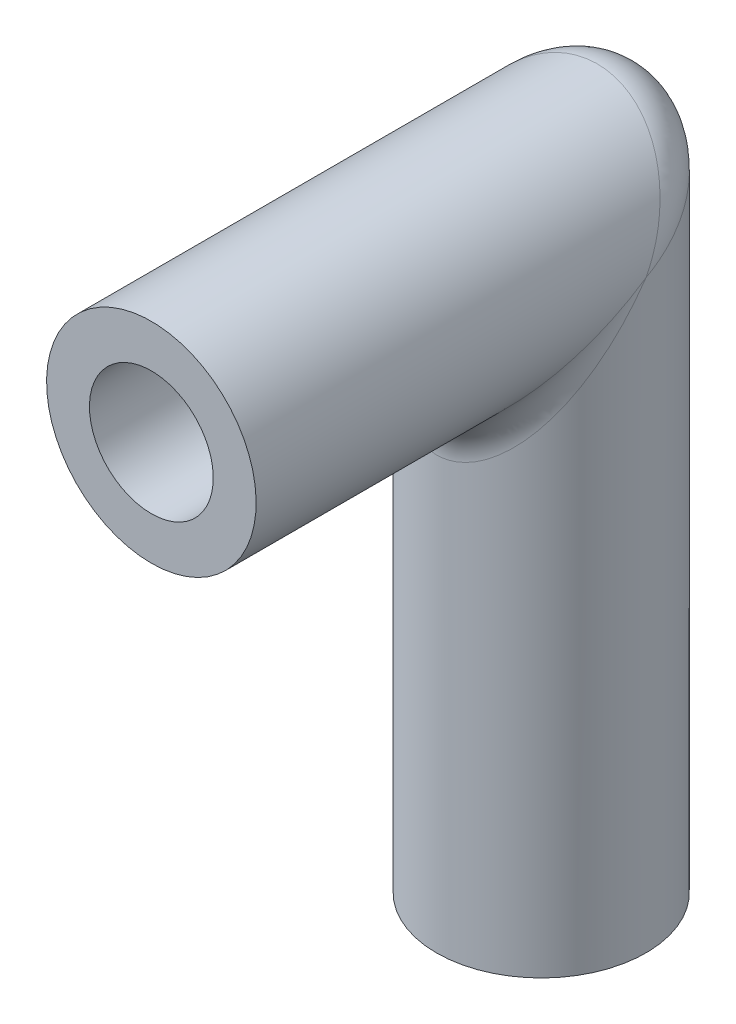
ISO-10303-21;
HEADER;
FILE_DESCRIPTION(('STEP AP214'),'2;1');
FILE_NAME('part.step','',(''),(''),'','','');
FILE_SCHEMA(('AUTOMOTIVE_DESIGN { 1 0 10303 214 1 1 1 1 }'));
ENDSEC;
DATA;
#1=APPLICATION_CONTEXT('core data for automotive mechanical design processes');
#2=APPLICATION_PROTOCOL_DEFINITION('international standard','automotive_design',2000,#1);
#3=PRODUCT_CONTEXT('',#1,'mechanical');
#4=PRODUCT('Part','Part','',(#3));
#5=PRODUCT_RELATED_PRODUCT_CATEGORY('part','',(#4));
#6=PRODUCT_DEFINITION_FORMATION('','',#4);
#7=PRODUCT_DEFINITION_CONTEXT('part definition',#1,'design');
#8=PRODUCT_DEFINITION('design','',#6,#7);
#9=PRODUCT_DEFINITION_SHAPE('','',#8);
#10=(LENGTH_UNIT() NAMED_UNIT(*) SI_UNIT(.MILLI.,.METRE.));
#11=(NAMED_UNIT(*) PLANE_ANGLE_UNIT() SI_UNIT($,.RADIAN.));
#12=(NAMED_UNIT(*) SI_UNIT($,.STERADIAN.) SOLID_ANGLE_UNIT());
#13=UNCERTAINTY_MEASURE_WITH_UNIT(LENGTH_MEASURE(1.E-05),#10,'distance_accuracy_value','');
#14=(GEOMETRIC_REPRESENTATION_CONTEXT(3) GLOBAL_UNCERTAINTY_ASSIGNED_CONTEXT((#13)) GLOBAL_UNIT_ASSIGNED_CONTEXT((#10,
#11,#12)) REPRESENTATION_CONTEXT('',''));
#15=CARTESIAN_POINT('',(0.,0.,0.));
#16=DIRECTION('',(0.,0.,1.));
#17=DIRECTION('',(1.,0.,0.));
#18=AXIS2_PLACEMENT_3D('',#15,#16,#17);
#19=CARTESIAN_POINT('',(0.,60.,-11.925));
#20=DIRECTION('',(0.,0.,1.));
#21=DIRECTION('',(0.,-1.,0.));
#22=AXIS2_PLACEMENT_3D('',#19,#20,#21);
#23=CYLINDRICAL_SURFACE('',#22,10.75);
#24=CARTESIAN_POINT('',(0.,60.,0.));
#25=DIRECTION('',(0.,-0.825949873501593,-0.563743564453468));
#26=DIRECTION('',(0.,0.563743564453469,-0.825949873501593));
#27=AXIS2_PLACEMENT_3D('',#24,#25,#26);
#28=ELLIPSE('',#27,19.0689538255249,10.75);
#29=CARTESIAN_POINT('',(-10.75,60.,0.));
#30=VERTEX_POINT('',#29);
#31=CARTESIAN_POINT('',(10.75,60.,0.));
#32=VERTEX_POINT('',#31);
#33=EDGE_CURVE('E51',#30,#32,#28,.F.);
#34=ORIENTED_EDGE('',*,*,#33,.T.);
#35=CARTESIAN_POINT('',(0.,60.,0.));
#36=DIRECTION('',(0.,-0.47165225033716,-0.881784641934692));
#37=DIRECTION('',(0.,0.881784641934692,-0.47165225033716));
#38=AXIS2_PLACEMENT_3D('',#35,#36,#37);
#39=ELLIPSE('',#38,12.1911853402366,10.75);
#40=EDGE_CURVE('E11',#32,#30,#39,.F.);
#41=ORIENTED_EDGE('',*,*,#40,.T.);
#42=EDGE_LOOP('',(#34,#41));
#43=FACE_BOUND('',#42,.T.);
#44=CARTESIAN_POINT('',(0.,60.,40.));
#45=DIRECTION('',(0.,0.,1.));
#46=DIRECTION('',(0.,-1.,0.));
#47=AXIS2_PLACEMENT_3D('',#44,#45,#46);
#48=CIRCLE('',#47,10.75);
#49=CARTESIAN_POINT('',(0.,49.25,40.));
#50=VERTEX_POINT('',#49);
#51=EDGE_CURVE('E116',#50,#50,#48,.T.);
#52=ORIENTED_EDGE('',*,*,#51,.F.);
#53=EDGE_LOOP('',(#52));
#54=FACE_BOUND('',#53,.T.);
#55=ADVANCED_FACE('F38',(#43,#54),#23,.T.);
#56=CARTESIAN_POINT('',(0.,0.,0.));
#57=DIRECTION('',(0.,1.,0.));
#58=DIRECTION('',(0.,0.,1.));
#59=AXIS2_PLACEMENT_3D('',#56,#57,#58);
#60=CYLINDRICAL_SURFACE('',#59,10.75);
#61=CARTESIAN_POINT('',(0.,0.,0.));
#62=DIRECTION('',(0.,1.,0.));
#63=DIRECTION('',(0.,0.,1.));
#64=AXIS2_PLACEMENT_3D('',#61,#62,#63);
#65=CIRCLE('',#64,10.75);
#66=CARTESIAN_POINT('',(0.,0.,10.75));
#67=VERTEX_POINT('',#66);
#68=EDGE_CURVE('E114',#67,#67,#65,.T.);
#69=ORIENTED_EDGE('',*,*,#68,.T.);
#70=EDGE_LOOP('',(#69));
#71=FACE_BOUND('',#70,.T.);
#72=CARTESIAN_POINT('',(0.,60.,0.));
#73=DIRECTION('',(0.,-0.881784641934692,-0.47165225033716));
#74=DIRECTION('',(0.,0.471652250337161,-0.881784641934692));
#75=AXIS2_PLACEMENT_3D('',#72,#73,#74);
#76=ELLIPSE('',#75,12.1911853402366,10.75);
#77=EDGE_CURVE('E62',#30,#32,#76,.T.);
#78=ORIENTED_EDGE('',*,*,#77,.T.);
#79=CARTESIAN_POINT('',(0.,60.,0.));
#80=DIRECTION('',(0.,-0.563743564453468,-0.825949873501593));
#81=DIRECTION('',(0.,0.825949873501593,-0.563743564453468));
#82=AXIS2_PLACEMENT_3D('',#79,#80,#81);
#83=ELLIPSE('',#82,19.0689538255249,10.75);
#84=EDGE_CURVE('E66',#32,#30,#83,.T.);
#85=ORIENTED_EDGE('',*,*,#84,.T.);
#86=EDGE_LOOP('',(#78,#85));
#87=FACE_BOUND('',#86,.T.);
#88=ADVANCED_FACE('F69',(#71,#87),#60,.T.);
#89=CARTESIAN_POINT('',(0.,60.,40.));
#90=DIRECTION('',(0.,0.,1.));
#91=DIRECTION('',(0.,-1.,0.));
#92=AXIS2_PLACEMENT_3D('',#89,#90,#91);
#93=PLANE('',#92);
#94=CARTESIAN_POINT('',(0.,60.,40.));
#95=DIRECTION('',(0.,0.,1.));
#96=DIRECTION('',(0.,-1.,0.));
#97=AXIS2_PLACEMENT_3D('',#94,#95,#96);
#98=CIRCLE('',#97,6.35);
#99=CARTESIAN_POINT('',(0.,53.65,40.));
#100=VERTEX_POINT('',#99);
#101=EDGE_CURVE('E109',#100,#100,#98,.F.);
#102=ORIENTED_EDGE('',*,*,#101,.T.);
#103=EDGE_LOOP('',(#102));
#104=FACE_BOUND('',#103,.T.);
#105=ORIENTED_EDGE('',*,*,#51,.T.);
#106=EDGE_LOOP('',(#105));
#107=FACE_BOUND('',#106,.T.);
#108=ADVANCED_FACE('F84',(#104,#107),#93,.T.);
#109=CARTESIAN_POINT('',(0.,0.,0.));
#110=DIRECTION('',(0.,1.,0.));
#111=DIRECTION('',(0.,0.,1.));
#112=AXIS2_PLACEMENT_3D('',#109,#110,#111);
#113=PLANE('',#112);
#114=CARTESIAN_POINT('',(0.,0.,0.));
#115=DIRECTION('',(0.,1.,0.));
#116=DIRECTION('',(0.,0.,1.));
#117=AXIS2_PLACEMENT_3D('',#114,#115,#116);
#118=CIRCLE('',#117,6.35);
#119=CARTESIAN_POINT('',(0.,0.,6.35));
#120=VERTEX_POINT('',#119);
#121=EDGE_CURVE('E105',#120,#120,#118,.F.);
#122=ORIENTED_EDGE('',*,*,#121,.F.);
#123=EDGE_LOOP('',(#122));
#124=FACE_BOUND('',#123,.T.);
#125=ORIENTED_EDGE('',*,*,#68,.F.);
#126=EDGE_LOOP('',(#125));
#127=FACE_BOUND('',#126,.T.);
#128=ADVANCED_FACE('F89',(#124,#127),#113,.F.);
#129=CARTESIAN_POINT('',(0.,60.,-7.08500000000001));
#130=DIRECTION('',(0.,0.,1.));
#131=DIRECTION('',(0.,-1.,0.));
#132=AXIS2_PLACEMENT_3D('',#129,#130,#131);
#133=CYLINDRICAL_SURFACE('',#132,6.35);
#134=CARTESIAN_POINT('',(0.,60.,0.));
#135=DIRECTION('',(0.,0.707106781186547,0.707106781186548));
#136=DIRECTION('',(0.,0.707106781186548,-0.707106781186547));
#137=AXIS2_PLACEMENT_3D('',#134,#135,#136);
#138=ELLIPSE('',#137,8.98025612106915,6.35);
#139=CARTESIAN_POINT('',(0.,66.35,-6.35));
#140=VERTEX_POINT('',#139);
#141=EDGE_CURVE('E70',#140,#140,#138,.T.);
#142=ORIENTED_EDGE('',*,*,#141,.F.);
#143=EDGE_LOOP('',(#142));
#144=FACE_BOUND('',#143,.T.);
#145=ORIENTED_EDGE('',*,*,#101,.F.);
#146=EDGE_LOOP('',(#145));
#147=FACE_BOUND('',#146,.T.);
#148=ADVANCED_FACE('F93',(#144,#147),#133,.F.);
#149=CARTESIAN_POINT('',(0.,0.,0.));
#150=DIRECTION('',(0.,1.,0.));
#151=DIRECTION('',(0.,0.,1.));
#152=AXIS2_PLACEMENT_3D('',#149,#150,#151);
#153=CYLINDRICAL_SURFACE('',#152,6.35);
#154=ORIENTED_EDGE('',*,*,#121,.T.);
#155=EDGE_LOOP('',(#154));
#156=FACE_BOUND('',#155,.T.);
#157=ORIENTED_EDGE('',*,*,#141,.T.);
#158=EDGE_LOOP('',(#157));
#159=FACE_BOUND('',#158,.T.);
#160=ADVANCED_FACE('F79',(#156,#159),#153,.F.);
#161=CARTESIAN_POINT('',(-10.75,60.,0.));
#162=CARTESIAN_POINT('',(-10.75,60.,0.));
#163=CARTESIAN_POINT('',(-10.75,60.,0.));
#164=CARTESIAN_POINT('',(-10.7499864952657,59.765792574378,0.343141111957927));
#165=CARTESIAN_POINT('',(-10.7500300295719,59.7113261174278,0.28867388257221));
#166=CARTESIAN_POINT('',(-10.7499864952657,59.6568588880421,0.234207425622054));
#167=CARTESIAN_POINT('',(-10.7423462808876,59.5316189407649,0.686232714693343));
#168=CARTESIAN_POINT('',(-10.738775653555,59.4224886744545,0.577511325545491));
#169=CARTESIAN_POINT('',(-10.7423462808876,59.3137672853067,0.468381059235112));
#170=CARTESIAN_POINT('',(-10.7117215273002,59.0637549546507,1.37170785713967));
#171=CARTESIAN_POINT('',(-10.6939192618354,58.8465163304425,1.1534836695575));
#172=CARTESIAN_POINT('',(-10.7117215273002,58.6282921428603,0.936245045349278));
#173=CARTESIAN_POINT('',(-10.688735708069,58.8300646440963,1.71409133539385));
#174=CARTESIAN_POINT('',(-10.6602515009435,58.5589733481407,1.44102665185928));
#175=CARTESIAN_POINT('',(-10.688735708069,58.2859086646062,1.16993535590373));
#176=CARTESIAN_POINT('',(-10.5971662296306,58.1345093959128,2.73316065249983));
#177=CARTESIAN_POINT('',(-10.5262302648046,57.7046610417163,2.29533895828375));
#178=CARTESIAN_POINT('',(-10.5971662296306,57.2668393475002,1.8654906040872));
#179=CARTESIAN_POINT('',(-10.5059710978055,57.6740188497976,3.40783284797095));
#180=CARTESIAN_POINT('',(-10.39242845443,57.1411091149097,2.85889088509035));
#181=CARTESIAN_POINT('',(-10.5059710978055,56.5921671520291,2.3259811502024));
#182=CARTESIAN_POINT('',(-10.2634849708032,56.7690255751843,4.73375322705557));
#183=CARTESIAN_POINT('',(-10.0412325352975,56.0481165286478,3.95188347135216));
#184=CARTESIAN_POINT('',(-10.2634849708032,55.2662467729444,3.2309744248157));
#185=CARTESIAN_POINT('',(-10.1132276169115,56.3243842344763,5.38520449367421));
#186=CARTESIAN_POINT('',(-9.82333101973887,55.515442956505,4.48455704349502));
#187=CARTESIAN_POINT('',(-10.1132276169115,54.6147955063258,3.67561576552366));
#188=CARTESIAN_POINT('',(-9.75465403234978,55.4587175279937,6.65350687759067));
#189=CARTESIAN_POINT('',(-9.3122604088946,54.4988504090812,5.5011495909188));
#190=CARTESIAN_POINT('',(-9.75465403234978,53.3464931224093,4.54128247200634));
#191=CARTESIAN_POINT('',(-9.54785923109783,55.037380229083,7.27081501320391));
#192=CARTESIAN_POINT('',(-9.01834291721466,54.0118033131634,5.98819668683661));
#193=CARTESIAN_POINT('',(-9.54785923109784,52.7291849867961,4.96261977091698));
#194=CARTESIAN_POINT('',(-9.07926524767911,54.2257458605632,8.45995373917482));
#195=CARTESIAN_POINT('',(-8.36753139008858,53.100251965459,6.89974803454102));
#196=CARTESIAN_POINT('',(-9.07926524767911,51.5400462608252,5.77425413943676));
#197=CARTESIAN_POINT('',(-8.81942637333802,53.8348876576007,9.03260645514335));
#198=CARTESIAN_POINT('',(-8.00968896071207,52.6728098721454,7.3271901278546));
#199=CARTESIAN_POINT('',(-8.81942637333802,50.9673935448567,6.16511234239935));
#200=CARTESIAN_POINT('',(-8.24872192375031,53.0911439410169,10.1222774817659));
#201=CARTESIAN_POINT('',(-7.24792613742725,51.8923212241812,8.10767877581882));
#202=CARTESIAN_POINT('',(-8.24872192375031,49.8777225182341,6.90885605898315));
#203=CARTESIAN_POINT('',(-7.94017011260427,52.7373799179489,10.6405829109116));
#204=CARTESIAN_POINT('',(-6.84295062593441,51.5366444676399,8.46335553236005));
#205=CARTESIAN_POINT('',(-7.94017011260428,49.3594170890884,7.26262008205108));
#206=CARTESIAN_POINT('',(-7.27705809737741,52.0742569396195,11.6121351814881));
#207=CARTESIAN_POINT('',(-6.00885454094664,50.9080827349302,9.09191726506977));
#208=CARTESIAN_POINT('',(-7.27705809737741,48.3878648185119,7.92574306038046));
#209=CARTESIAN_POINT('',(-6.92501795157464,51.7636482950325,12.0672129630935));
#210=CARTESIAN_POINT('',(-5.57874882876969,50.6330144232213,9.36698557677865));
#211=CARTESIAN_POINT('',(-6.92501795157464,47.9327870369065,8.23635170496754));
#212=CARTESIAN_POINT('',(-6.18047045521437,51.1923885613562,12.9041748984767));
#213=CARTESIAN_POINT('',(-4.72057386704508,50.1683007671008,9.83169923289918));
#214=CARTESIAN_POINT('',(-6.18047045521437,47.0958251015233,8.8076114386438));
#215=CARTESIAN_POINT('',(-5.79049326303583,50.9301195086102,13.2884295571472));
#216=CARTESIAN_POINT('',(-4.29184164878177,49.9770306113492,10.0229693886509));
#217=CARTESIAN_POINT('',(-5.79049326303583,46.7115704428528,9.06988049138978));
#218=CARTESIAN_POINT('',(-5.17623535189942,50.57546652131,13.8080374222692));
#219=CARTESIAN_POINT('',(-3.67099922835243,49.7494075025635,10.2505924974365));
#220=CARTESIAN_POINT('',(-5.17623535189942,46.1919625777308,9.42453347868998));
#221=CARTESIAN_POINT('',(-4.97163135906662,50.4658269775867,13.9686721026127));
#222=CARTESIAN_POINT('',(-3.46991448249914,49.6838468587943,10.3161531412057));
#223=CARTESIAN_POINT('',(-4.97163135906662,46.0313278973873,9.53417302241335));
#224=CARTESIAN_POINT('',(-4.55108192073747,50.2580755999522,14.2730520279818));
#225=CARTESIAN_POINT('',(-3.07354574800001,49.5688403463363,10.4311596536637));
#226=CARTESIAN_POINT('',(-4.55108192073747,45.7269479720182,9.74192440004778));
#227=CARTESIAN_POINT('',(-4.33514155829133,50.1599586622989,14.4168047505833));
#228=CARTESIAN_POINT('',(-2.87850585160852,49.5196707823381,10.4803292176619));
#229=CARTESIAN_POINT('',(-4.33514155829133,45.5831952494167,9.84004133770112));
#230=CARTESIAN_POINT('',(-3.90113860189644,49.9801879922921,14.6801896857136));
#231=CARTESIAN_POINT('',(-2.50490506135847,49.4378273782373,10.5621726217627));
#232=CARTESIAN_POINT('',(-3.90113860189644,45.3198103142864,10.0198120077079));
#233=CARTESIAN_POINT('',(-3.68348344700928,49.8980431914765,14.8005413706397));
#234=CARTESIAN_POINT('',(-2.32623783990868,49.4048026506903,10.5951973493097));
#235=CARTESIAN_POINT('',(-3.68348344700928,45.1994586293603,10.1019568085235));
#236=CARTESIAN_POINT('',(-3.23927275192173,49.7469710153319,15.0218796752239));
#237=CARTESIAN_POINT('',(-1.97947825338666,49.350536689707,10.649463310293));
#238=CARTESIAN_POINT('',(-3.23927275192173,44.9781203247761,10.2530289846681));
#239=CARTESIAN_POINT('',(-3.01272157822205,49.6780372508698,15.122875655705));
#240=CARTESIAN_POINT('',(-1.81179083989099,49.3294773406818,10.6705226593182));
#241=CARTESIAN_POINT('',(-3.01272157822205,44.877124344295,10.3219627491302));
#242=CARTESIAN_POINT('',(-2.55872178852412,49.5563886174422,15.3011050488613));
#243=CARTESIAN_POINT('',(-1.49277861554929,49.2970149508268,10.7029850491732));
#244=CARTESIAN_POINT('',(-2.55872178852412,44.6988949511387,10.4436113825578));
#245=CARTESIAN_POINT('',(-2.33149907468291,49.5032533521752,15.378954391001));
#246=CARTESIAN_POINT('',(-1.34149541360153,49.2854605895732,10.7145394104268));
#247=CARTESIAN_POINT('',(-2.3314990746829,44.621045608999,10.4967466478248));
#248=CARTESIAN_POINT('',(-1.87124364696235,49.411515949136,15.513360353595));
#249=CARTESIAN_POINT('',(-1.04919407595017,49.2682929224236,10.7317070775764));
#250=CARTESIAN_POINT('',(-1.87124364696235,44.486639646405,10.588484050864));
#251=CARTESIAN_POINT('',(-1.63821119394491,49.3729131600926,15.5699179282373));
#252=CARTESIAN_POINT('',(-0.908605290340172,49.2627479448982,10.7372520551018));
#253=CARTESIAN_POINT('',(-1.63821119394491,44.4300820717627,10.6270868399075));
#254=CARTESIAN_POINT('',(-1.17193543651173,49.3115270081441,15.6598557787649));
#255=CARTESIAN_POINT('',(-0.637650171709598,49.2551451438805,10.7448548561195));
#256=CARTESIAN_POINT('',(-1.17193543651173,44.3401442212351,10.6884729918559));
#257=CARTESIAN_POINT('',(-0.938757553382102,49.28849591443,15.6935990090913));
#258=CARTESIAN_POINT('',(-0.507539452800943,49.2530600810066,10.7469399189934));
#259=CARTESIAN_POINT('',(-0.938757553382102,44.3064009909087,10.71150408557));
#260=CARTESIAN_POINT('',(-0.470386422887839,49.2577325464131,15.7386709203723));
#261=CARTESIAN_POINT('',(-0.251431481154688,49.2504834397004,10.7495165602996));
#262=CARTESIAN_POINT('',(-0.470386422887839,44.2613290796277,10.7422674535869));
#263=CARTESIAN_POINT('',(-0.23519321144392,49.25,15.75));
#264=CARTESIAN_POINT('',(-0.125806364460488,49.25,10.75));
#265=CARTESIAN_POINT('',(-0.23519321144392,44.25,10.75));
#266=CARTESIAN_POINT('',(0.235193211443917,49.25,15.75));
#267=CARTESIAN_POINT('',(0.125806364460487,49.25,10.75));
#268=CARTESIAN_POINT('',(0.235193211443918,44.25,10.75));
#269=CARTESIAN_POINT('',(0.470386422887836,49.2577325464131,15.7386709203723));
#270=CARTESIAN_POINT('',(0.251431481154686,49.2504834397004,10.7495165602996));
#271=CARTESIAN_POINT('',(0.470386422887836,44.2613290796277,10.7422674535869));
#272=CARTESIAN_POINT('',(0.938757553382099,49.28849591443,15.6935990090913));
#273=CARTESIAN_POINT('',(0.507539452800941,49.2530600810066,10.7469399189934));
#274=CARTESIAN_POINT('',(0.938757553382099,44.3064009909087,10.71150408557));
#275=CARTESIAN_POINT('',(1.17193543651172,49.3115270081441,15.6598557787649));
#276=CARTESIAN_POINT('',(0.637650171709596,49.2551451438805,10.7448548561194));
#277=CARTESIAN_POINT('',(1.17193543651172,44.3401442212351,10.6884729918559));
#278=CARTESIAN_POINT('',(1.63821119394491,49.3729131600926,15.5699179282373));
#279=CARTESIAN_POINT('',(0.908605290340172,49.2627479448982,10.7372520551018));
#280=CARTESIAN_POINT('',(1.63821119394491,44.4300820717627,10.6270868399075));
#281=CARTESIAN_POINT('',(1.87124364696235,49.411515949136,15.513360353595));
#282=CARTESIAN_POINT('',(1.04919407595017,49.2682929224236,10.7317070775764));
#283=CARTESIAN_POINT('',(1.87124364696235,44.486639646405,10.588484050864));
#284=CARTESIAN_POINT('',(2.3314990746829,49.5032533521752,15.378954391001));
#285=CARTESIAN_POINT('',(1.34149541360153,49.2854605895732,10.7145394104268));
#286=CARTESIAN_POINT('',(2.3314990746829,44.621045608999,10.4967466478248));
#287=CARTESIAN_POINT('',(2.55872178852412,49.5563886174422,15.3011050488613));
#288=CARTESIAN_POINT('',(1.49277861554929,49.2970149508268,10.7029850491732));
#289=CARTESIAN_POINT('',(2.55872178852412,44.6988949511387,10.4436113825578));
#290=CARTESIAN_POINT('',(3.01272157822205,49.6780372508698,15.122875655705));
#291=CARTESIAN_POINT('',(1.81179083989099,49.3294773406818,10.6705226593182));
#292=CARTESIAN_POINT('',(3.01272157822205,44.877124344295,10.3219627491302));
#293=CARTESIAN_POINT('',(3.23927275192173,49.7469710153319,15.0218796752239));
#294=CARTESIAN_POINT('',(1.97947825338666,49.350536689707,10.649463310293));
#295=CARTESIAN_POINT('',(3.23927275192173,44.9781203247761,10.2530289846681));
#296=CARTESIAN_POINT('',(3.68348344700928,49.8980431914765,14.8005413706397));
#297=CARTESIAN_POINT('',(2.32623783990868,49.4048026506903,10.5951973493097));
#298=CARTESIAN_POINT('',(3.68348344700928,45.1994586293603,10.1019568085235));
#299=CARTESIAN_POINT('',(3.90113860189644,49.9801879922921,14.6801896857136));
#300=CARTESIAN_POINT('',(2.50490506135847,49.4378273782373,10.5621726217627));
#301=CARTESIAN_POINT('',(3.90113860189644,45.3198103142864,10.0198120077079));
#302=CARTESIAN_POINT('',(4.33514155829133,50.1599586622989,14.4168047505833));
#303=CARTESIAN_POINT('',(2.87850585160852,49.5196707823382,10.4803292176619));
#304=CARTESIAN_POINT('',(4.33514155829133,45.5831952494167,9.84004133770112));
#305=CARTESIAN_POINT('',(4.55108192073747,50.2580755999522,14.2730520279818));
#306=CARTESIAN_POINT('',(3.073545748,49.5688403463363,10.4311596536637));
#307=CARTESIAN_POINT('',(4.55108192073747,45.7269479720182,9.74192440004778));
#308=CARTESIAN_POINT('',(4.97163135906662,50.4658269775867,13.9686721026127));
#309=CARTESIAN_POINT('',(3.46991448249913,49.6838468587943,10.3161531412057));
#310=CARTESIAN_POINT('',(4.97163135906662,46.0313278973873,9.53417302241335));
#311=CARTESIAN_POINT('',(5.17623535189941,50.57546652131,13.8080374222692));
#312=CARTESIAN_POINT('',(3.67099922835243,49.7494075025635,10.2505924974365));
#313=CARTESIAN_POINT('',(5.17623535189941,46.1919625777308,9.42453347868998));
#314=CARTESIAN_POINT('',(5.79049326303583,50.9301195086102,13.2884295571472));
#315=CARTESIAN_POINT('',(4.29184164878177,49.9770306113491,10.0229693886509));
#316=CARTESIAN_POINT('',(5.79049326303583,46.7115704428528,9.06988049138978));
#317=CARTESIAN_POINT('',(6.18047045521437,51.1923885613562,12.9041748984767));
#318=CARTESIAN_POINT('',(4.72057386704507,50.1683007671008,9.83169923289918));
#319=CARTESIAN_POINT('',(6.18047045521437,47.0958251015233,8.8076114386438));
#320=CARTESIAN_POINT('',(6.92501795157464,51.7636482950324,12.0672129630935));
#321=CARTESIAN_POINT('',(5.57874882876968,50.6330144232213,9.36698557677865));
#322=CARTESIAN_POINT('',(6.92501795157464,47.9327870369065,8.23635170496754));
#323=CARTESIAN_POINT('',(7.27705809737741,52.0742569396195,11.6121351814881));
#324=CARTESIAN_POINT('',(6.00885454094664,50.9080827349302,9.09191726506978));
#325=CARTESIAN_POINT('',(7.27705809737741,48.3878648185119,7.92574306038047));
#326=CARTESIAN_POINT('',(7.94017011260427,52.7373799179489,10.6405829109116));
#327=CARTESIAN_POINT('',(6.84295062593441,51.5366444676399,8.46335553236006));
#328=CARTESIAN_POINT('',(7.94017011260427,49.3594170890884,7.26262008205108));
#329=CARTESIAN_POINT('',(8.2487219237503,53.0911439410169,10.1222774817659));
#330=CARTESIAN_POINT('',(7.24792613742725,51.8923212241812,8.10767877581882));
#331=CARTESIAN_POINT('',(8.24872192375031,49.8777225182341,6.90885605898315));
#332=CARTESIAN_POINT('',(8.81942637333801,53.8348876576007,9.03260645514336));
#333=CARTESIAN_POINT('',(8.00968896071207,52.6728098721454,7.3271901278546));
#334=CARTESIAN_POINT('',(8.81942637333801,50.9673935448566,6.16511234239935));
#335=CARTESIAN_POINT('',(9.07926524767911,54.2257458605632,8.45995373917483));
#336=CARTESIAN_POINT('',(8.36753139008858,53.100251965459,6.89974803454103));
#337=CARTESIAN_POINT('',(9.07926524767911,51.5400462608252,5.77425413943677));
#338=CARTESIAN_POINT('',(9.54785923109783,55.037380229083,7.27081501320392));
#339=CARTESIAN_POINT('',(9.01834291721466,54.0118033131634,5.98819668683662));
#340=CARTESIAN_POINT('',(9.54785923109783,52.7291849867961,4.96261977091698));
#341=CARTESIAN_POINT('',(9.75465403234978,55.4587175279937,6.65350687759068));
#342=CARTESIAN_POINT('',(9.3122604088946,54.4988504090812,5.5011495909188));
#343=CARTESIAN_POINT('',(9.75465403234978,53.3464931224093,4.54128247200634));
#344=CARTESIAN_POINT('',(10.1132276169115,56.3243842344763,5.38520449367421));
#345=CARTESIAN_POINT('',(9.82333101973887,55.515442956505,4.48455704349502));
#346=CARTESIAN_POINT('',(10.1132276169115,54.6147955063258,3.67561576552366));
#347=CARTESIAN_POINT('',(10.2634849708032,56.7690255751843,4.73375322705557));
#348=CARTESIAN_POINT('',(10.0412325352975,56.0481165286478,3.95188347135216));
#349=CARTESIAN_POINT('',(10.2634849708032,55.2662467729444,3.2309744248157));
#350=CARTESIAN_POINT('',(10.5059710978055,57.6740188497976,3.40783284797095));
#351=CARTESIAN_POINT('',(10.39242845443,57.1411091149097,2.85889088509035));
#352=CARTESIAN_POINT('',(10.5059710978055,56.5921671520291,2.3259811502024));
#353=CARTESIAN_POINT('',(10.5971662296306,58.1345093959128,2.73316065249983));
#354=CARTESIAN_POINT('',(10.5262302648046,57.7046610417163,2.29533895828375));
#355=CARTESIAN_POINT('',(10.5971662296306,57.2668393475002,1.8654906040872));
#356=CARTESIAN_POINT('',(10.688735708069,58.8300646440963,1.71409133539385));
#357=CARTESIAN_POINT('',(10.6602515009435,58.5589733481407,1.44102665185928));
#358=CARTESIAN_POINT('',(10.688735708069,58.2859086646062,1.16993535590373));
#359=CARTESIAN_POINT('',(10.7117215273002,59.0637549546507,1.37170785713967));
#360=CARTESIAN_POINT('',(10.6939192618354,58.8465163304425,1.1534836695575));
#361=CARTESIAN_POINT('',(10.7117215273002,58.6282921428603,0.936245045349279));
#362=CARTESIAN_POINT('',(10.7423462808876,59.5316189407649,0.686232714693344));
#363=CARTESIAN_POINT('',(10.738775653555,59.4224886744545,0.577511325545492));
#364=CARTESIAN_POINT('',(10.7423462808876,59.3137672853067,0.468381059235113));
#365=CARTESIAN_POINT('',(10.7499864952657,59.765792574378,0.343141111957929));
#366=CARTESIAN_POINT('',(10.7500300295719,59.7113261174278,0.288673882572211));
#367=CARTESIAN_POINT('',(10.7499864952657,59.6568588880421,0.234207425622055));
#368=CARTESIAN_POINT('',(10.75,60.,0.));
#369=CARTESIAN_POINT('',(10.75,60.,0.));
#370=CARTESIAN_POINT('',(10.75,60.,0.));
#371=(BOUNDED_SURFACE() B_SPLINE_SURFACE(3,2,((#161,#162,#163),(#164,#165,#166),(#167,#168,
#169),(#170,#171,#172),(#173,#174,#175),(#176,#177,#178),(#179,#180,#181),(#182,#183,#184),
(#185,#186,#187),(#188,#189,#190),(#191,#192,#193),(#194,#195,#196),(#197,#198,#199),(#200,#201,
#202),(#203,#204,#205),(#206,#207,#208),(#209,#210,#211),(#212,#213,#214),(#215,#216,#217),
(#218,#219,#220),(#221,#222,#223),(#224,#225,#226),(#227,#228,#229),(#230,#231,#232),(#233,#234,
#235),(#236,#237,#238),(#239,#240,#241),(#242,#243,#244),(#245,#246,#247),(#248,#249,#250),
(#251,#252,#253),(#254,#255,#256),(#257,#258,#259),(#260,#261,#262),(#263,#264,#265),(#266,#267,
#268),(#269,#270,#271),(#272,#273,#274),(#275,#276,#277),(#278,#279,#280),(#281,#282,#283),
(#284,#285,#286),(#287,#288,#289),(#290,#291,#292),(#293,#294,#295),(#296,#297,#298),(#299,#300,
#301),(#302,#303,#304),(#305,#306,#307),(#308,#309,#310),(#311,#312,#313),(#314,#315,#316),
(#317,#318,#319),(#320,#321,#322),(#323,#324,#325),(#326,#327,#328),(#329,#330,#331),(#332,#333,
#334),(#335,#336,#337),(#338,#339,#340),(#341,#342,#343),(#344,#345,#346),(#347,#348,#349),
(#350,#351,#352),(#353,#354,#355),(#356,#357,#358),(#359,#360,#361),(#362,#363,#364),(#365,#366,
#367),(#368,#369,#370)),.UNSPECIFIED.,.F.,.F.,.F.) B_SPLINE_SURFACE_WITH_KNOTS((4,2,2,2,2,2,2,2,
2,2,2,2,2,2,2,2,2,2,2,2,2,2,2,2,2,2,2,2,2,2,2,2,2,2,4),(3,3),(0.,1.45555246733584,
2.9112263617452,5.79693125914962,8.63423435984037,11.4016422184346,14.0809633040029,
16.6584875223356,19.1262037452152,21.4830009306311,22.6104511323044,23.7374000503966,
24.8206226807175,25.903320112612,26.953905991076,28.0044447820584,29.0378503725279,
30.0712375819838,31.1046247914397,32.1380303819092,33.1885691728916,34.2391550513556,
35.3218524832502,36.4050751135711,37.5320240316632,38.6594742333365,41.0162714187524,
43.483987641632,46.0615118599648,48.740832945533,51.5082408041273,54.345543904818,
57.2312488022224,58.6869226966318,60.1424751639676),(0.,1.),
.UNSPECIFIED.) GEOMETRIC_REPRESENTATION_ITEM() RATIONAL_B_SPLINE_SURFACE(((1.,1.,1.),(1.,
0.999999960865935,1.),(1.,0.99964392274264,1.),(1.,0.998220838485226,1.),(1.,0.997153733038909,
1.),(1.,0.992912441874251,1.),(1.,0.988698134543174,1.),(1.,0.97761668316022,1.),(1.,
0.970795220637255,1.),(1.,0.954789226710292,1.),(1.,0.945667047703301,1.),(1.,0.925487989826963,
1.),(1.,0.914501934744279,1.),(1.,0.891169826601919,1.),(1.,0.878891303129094,1.),(1.,
0.853707619024582,1.),(1.,0.840851439255054,1.),(1.,0.81538526421593,1.),(1.,0.802790177124734,
1.),(1.,0.784723218025256,1.),(1.,0.778962685168039,1.),(1.,0.767759899846262,1.),(1.,
0.762317507007581,1.),(1.,0.752114588403187,1.),(1.,0.747335799236677,1.),(1.,0.738380659152147,
1.),(1.,0.734204017266479,1.),(1.,0.726721604356059,1.),(1.,0.72339367827938,1.),(1.,
0.717585867143039,1.),(1.,0.715105944080684,1.),(1.,0.711136414411883,1.),(1.,0.709631316384635,
1.),(1.,0.707616508624132,1.),(1.,0.707106781186547,1.),(1.,0.707106781186547,1.),(1.,
0.707616508624132,1.),(1.,0.709631316384635,1.),(1.,0.711136414411883,1.),(1.,0.715105944080684,
1.),(1.,0.717585867143038,1.),(1.,0.72339367827938,1.),(1.,0.726721604356059,1.),(1.,
0.734204017266479,1.),(1.,0.738380659152147,1.),(1.,0.747335799236677,1.),(1.,0.752114588403187,
1.),(1.,0.76231750700758,1.),(1.,0.767759899846262,1.),(1.,0.778962685168039,1.),(1.,
0.784723218025256,1.),(1.,0.802790177124734,1.),(1.,0.81538526421593,1.),(1.,0.840851439255054,
1.),(1.,0.853707619024582,1.),(1.,0.878891303129094,1.),(1.,0.891169826601919,1.),(1.,
0.914501934744279,1.),(1.,0.925487989826963,1.),(1.,0.945667047703301,1.),(1.,0.954789226710292,
1.),(1.,0.970795220637255,1.),(1.,0.97761668316022,1.),(1.,0.988698134543174,1.),(1.,
0.992912441874251,1.),(1.,0.997153733038909,1.),(1.,0.998220838485226,1.),(1.,0.99964392274264,
1.),(1.,0.999999960865935,1.),(1.,1.,1.))) REPRESENTATION_ITEM('') SURFACE());
#372=ORIENTED_EDGE('',*,*,#84,.F.);
#373=ORIENTED_EDGE('',*,*,#33,.F.);
#374=EDGE_LOOP('',(#372,#373));
#375=FACE_BOUND('',#374,.T.);
#376=ADVANCED_FACE('F72',(#375),#371,.F.);
#377=CARTESIAN_POINT('',(10.75,60.,0.));
#378=CARTESIAN_POINT('',(10.75,60.,0.));
#379=CARTESIAN_POINT('',(10.75,60.,0.));
#380=CARTESIAN_POINT('',(10.7499865113786,60.1252737354372,-0.234207418426089));
#381=CARTESIAN_POINT('',(10.7499948902665,60.1797408953539,-0.179740895353934));
#382=CARTESIAN_POINT('',(10.7499865113786,60.2342074184261,-0.125273735437223));
#383=CARTESIAN_POINT('',(10.7423462889444,60.2505294018523,-0.468381055636987));
#384=CARTESIAN_POINT('',(10.7459046932135,60.3595828056358,-0.359582805635843));
#385=CARTESIAN_POINT('',(10.7423462889444,60.4683810556369,-0.250529401852356));
#386=CARTESIAN_POINT('',(10.7117215192427,60.5007822354837,-0.936245048947725));
#387=CARTESIAN_POINT('',(10.7294923651009,60.7193409318438,-0.719340931843812));
#388=CARTESIAN_POINT('',(10.7117215192427,60.9362450489477,-0.500782235483677));
#389=CARTESIAN_POINT('',(10.6887356919533,60.6257793802633,-1.16993536310091));
#390=CARTESIAN_POINT('',(10.7171460953243,60.8995137583662,-0.899513758366243));
#391=CARTESIAN_POINT('',(10.6887356919533,61.1699353631009,-0.625779380263282));
#392=CARTESIAN_POINT('',(10.597166261578,60.9978205480431,-1.8654905898196));
#393=CARTESIAN_POINT('',(10.6677291723986,61.4382587597349,-1.43825875973487));
#394=CARTESIAN_POINT('',(10.597166261578,61.8654905898196,-0.997820548043038));
#395=CARTESIAN_POINT('',(10.5059712566997,61.2441294144777,-2.32598107924092));
#396=CARTESIAN_POINT('',(10.6181239057529,61.7982357545199,-1.79823575451991));
#397=CARTESIAN_POINT('',(10.5059712566997,62.3259810792409,-1.2441294144777));
#398=CARTESIAN_POINT('',(10.2634848145741,61.7281956598953,-3.23097449458694));
#399=CARTESIAN_POINT('',(10.4843940439437,62.5151016014232,-2.51510160142322));
#400=CARTESIAN_POINT('',(10.2634848145742,63.2309744945869,-1.72819565989534));
#401=CARTESIAN_POINT('',(10.1132270281209,61.9660271780216,-3.67561602847511));
#402=CARTESIAN_POINT('',(10.4000913439467,62.8740024727136,-2.87400247271358));
#403=CARTESIAN_POINT('',(10.1132270281209,63.6756160284751,-1.96602717802157));
#404=CARTESIAN_POINT('',(9.75465460663592,62.4290579292383,-4.54128221553253));
#405=CARTESIAN_POINT('',(10.1941192773678,63.5884790331143,-3.58847903311432));
#406=CARTESIAN_POINT('',(9.75465460663592,64.5412822155325,-2.42905792923833));
#407=CARTESIAN_POINT('',(9.54786135132135,62.6544240221577,-4.96261882403396));
#408=CARTESIAN_POINT('',(10.072206394703,63.9459975904187,-3.94599759041866));
#409=CARTESIAN_POINT('',(9.54786135132135,64.962618824034,-2.6544240221577));
#410=CARTESIAN_POINT('',(9.07926319494245,63.08855503005,-5.77425505618043));
#411=CARTESIAN_POINT('',(9.78606097589014,64.6573119852415,-4.65731198524151));
#412=CARTESIAN_POINT('',(9.07926319494246,65.7742550561804,-3.08855503004999));
#413=CARTESIAN_POINT('',(8.81941883137771,63.2976200312552,-6.16511571060752));
#414=CARTESIAN_POINT('',(9.62156758581692,65.0129191690968,-5.01291916909677));
#415=CARTESIAN_POINT('',(8.81941883137771,66.1651157106075,-3.29762003125516));
#416=CARTESIAN_POINT('',(8.24872917916493,63.6954329030497,-6.90885281874509));
#417=CARTESIAN_POINT('',(9.24236419946889,65.7193703555022,-5.71937035550217));
#418=CARTESIAN_POINT('',(8.24872917916493,66.9088528187451,-3.69543290304972));
#419=CARTESIAN_POINT('',(7.94019668322673,63.8846509060836,-7.26260821572137));
#420=CARTESIAN_POINT('',(9.02747682127451,66.0717973181859,-6.07179731818591));
#421=CARTESIAN_POINT('',(7.94019668322673,67.2626082157214,-3.8846509060836));
#422=CARTESIAN_POINT('',(7.2770326587198,64.2393570159796,-7.92575442117937));
#423=CARTESIAN_POINT('',(8.53589612653231,66.7689349726195,-6.76893497261944));
#424=CARTESIAN_POINT('',(7.27703265871981,67.9257544211794,-4.23935701597958));
#425=CARTESIAN_POINT('',(6.92492501481635,64.4055126472829,-8.23639321013807));
#426=CARTESIAN_POINT('',(8.25929943831951,67.1148692204111,-7.11486922041111));
#427=CARTESIAN_POINT('',(6.92492501481635,68.2363932101381,-4.40551264728285));
#428=CARTESIAN_POINT('',(6.18055921464641,64.7110267762363,-8.80757179904985));
#429=CARTESIAN_POINT('',(7.62945633411448,67.7919398575619,-7.79193985756184));
#430=CARTESIAN_POINT('',(6.18055921464641,68.8075717990499,-4.71102677623624));
#431=CARTESIAN_POINT('',(5.79081711842101,64.851254064074,-9.06973585891892));
#432=CARTESIAN_POINT('',(7.27690397298115,68.1237898398045,-8.12378983980453));
#433=CARTESIAN_POINT('',(5.790817118421,69.0697358589189,-4.85125406407394));
#434=CARTESIAN_POINT('',(4.97754708092445,65.1023677587242,-9.53920928805144));
#435=CARTESIAN_POINT('',(6.47904771900654,68.7589673609881,-8.7589673609881));
#436=CARTESIAN_POINT('',(4.97754708092445,69.5392092880514,-5.10236775872419));
#437=CARTESIAN_POINT('',(4.55627144220367,65.2142764707708,-9.74842992362175));
#438=CARTESIAN_POINT('',(6.03551427589834,69.0623897686752,-9.06238976867524));
#439=CARTESIAN_POINT('',(4.55627144220367,69.7484299236218,-5.2142764707708));
#440=CARTESIAN_POINT('',(3.90110581137531,65.359445717653,-10.0198332982176));
#441=CARTESIAN_POINT('',(5.29450478262183,69.4786456793141,-9.47864567931406));
#442=CARTESIAN_POINT('',(3.90110581137531,70.0198332982176,-5.35944571765302));
#443=CARTESIAN_POINT('',(3.68347468698973,65.4033752900064,-10.1019624986984));
#444=CARTESIAN_POINT('',(5.03805421328279,69.609626448871,-9.60962644887096));
#445=CARTESIAN_POINT('',(3.68347468698973,70.1019624986985,-5.40337529000641));
#446=CARTESIAN_POINT('',(3.23928156173587,65.4841752421916,-10.2530232788722));
#447=CARTESIAN_POINT('',(4.49638727665586,69.8575055774464,-9.85750557744639));
#448=CARTESIAN_POINT('',(3.23928156173587,70.2530232788722,-5.48417524219155));
#449=CARTESIAN_POINT('',(3.01272394103533,65.5210490334798,-10.3219612365056));
#450=CARTESIAN_POINT('',(4.21127324771525,69.9740383104723,-9.97403831047231));
#451=CARTESIAN_POINT('',(3.01272394103534,70.3219612365056,-5.5210490334798));
#452=CARTESIAN_POINT('',(2.55867032180408,65.5861255491173,-10.4436260266107));
#453=CARTESIAN_POINT('',(3.62232869466584,70.1848714776389,-10.1848714776388));
#454=CARTESIAN_POINT('',(2.55867032180408,70.4436260266107,-5.58612554911725));
#455=CARTESIAN_POINT('',(2.33139838725722,65.6145516259693,-10.4967704311532));
#456=CARTESIAN_POINT('',(3.31952120219735,70.2793627226364,-10.2793627226364));
#457=CARTESIAN_POINT('',(2.33139838725722,70.4967704311533,-5.61455162596923));
#458=CARTESIAN_POINT('',(1.87114162489222,65.6636166383094,-10.5885006716143));
#459=CARTESIAN_POINT('',(2.6912880561031,70.4456648605125,-10.4456648605125));
#460=CARTESIAN_POINT('',(1.87114162489222,70.5885006716143,-5.66361663830939));
#461=CARTESIAN_POINT('',(1.63815961946396,65.6842593414899,-10.6270935514793));
#462=CARTESIAN_POINT('',(2.36643195783387,70.5171062808653,-10.5171062808653));
#463=CARTESIAN_POINT('',(1.63815961946396,70.6270935514793,-5.68425934148994));
#464=CARTESIAN_POINT('',(1.17193530253093,65.7170902555944,-10.688473086548));
#465=CARTESIAN_POINT('',(1.70493735160637,70.6322608707591,-10.6322608707591));
#466=CARTESIAN_POINT('',(1.17193530253093,70.688473086548,-5.71709025559444));
#467=CARTESIAN_POINT('',(0.938757515102164,65.7294091747112,-10.7115041092428));
#468=CARTESIAN_POINT('',(1.36931386583069,70.6761111575215,-10.6761111575215));
#469=CARTESIAN_POINT('',(0.938757515102165,70.7115041092428,-5.72940917471123));
#470=CARTESIAN_POINT('',(0.470386461167094,65.7458639741408,-10.7422674299145));
#471=CARTESIAN_POINT('',(0.68867143704435,70.7350629123069,-10.7350629123068));
#472=CARTESIAN_POINT('',(0.470386461167093,70.7422674299145,-5.74586397414078));
#473=CARTESIAN_POINT('',(0.235193230583547,65.75,-10.75));
#474=CARTESIAN_POINT('',(0.344583937810225,70.75,-10.75));
#475=CARTESIAN_POINT('',(0.235193230583547,70.75,-5.75));
#476=CARTESIAN_POINT('',(-0.235193230583547,65.75,-10.75));
#477=CARTESIAN_POINT('',(-0.344583937810225,70.75,-10.75));
#478=CARTESIAN_POINT('',(-0.235193230583547,70.75,-5.75));
#479=CARTESIAN_POINT('',(-0.470386461167093,65.7458639741408,-10.7422674299145));
#480=CARTESIAN_POINT('',(-0.688671437044349,70.7350629123069,-10.7350629123068));
#481=CARTESIAN_POINT('',(-0.470386461167093,70.7422674299145,-5.74586397414078));
#482=CARTESIAN_POINT('',(-0.938757515102164,65.7294091747112,-10.7115041092428));
#483=CARTESIAN_POINT('',(-1.36931386583068,70.6761111575215,-10.6761111575215));
#484=CARTESIAN_POINT('',(-0.938757515102164,70.7115041092428,-5.72940917471123));
#485=CARTESIAN_POINT('',(-1.17193530253093,65.7170902555944,-10.688473086548));
#486=CARTESIAN_POINT('',(-1.70493735160637,70.6322608707591,-10.6322608707591));
#487=CARTESIAN_POINT('',(-1.17193530253093,70.688473086548,-5.71709025559444));
#488=CARTESIAN_POINT('',(-1.63815961946396,65.6842593414899,-10.6270935514793));
#489=CARTESIAN_POINT('',(-2.36643195783388,70.5171062808653,-10.5171062808653));
#490=CARTESIAN_POINT('',(-1.63815961946396,70.6270935514793,-5.68425934148994));
#491=CARTESIAN_POINT('',(-1.87114162489223,65.6636166383094,-10.5885006716143));
#492=CARTESIAN_POINT('',(-2.69128805610311,70.4456648605125,-10.4456648605125));
#493=CARTESIAN_POINT('',(-1.87114162489223,70.5885006716143,-5.66361663830939));
#494=CARTESIAN_POINT('',(-2.33139838725722,65.6145516259693,-10.4967704311532));
#495=CARTESIAN_POINT('',(-3.31952120219736,70.2793627226364,-10.2793627226364));
#496=CARTESIAN_POINT('',(-2.33139838725722,70.4967704311533,-5.61455162596923));
#497=CARTESIAN_POINT('',(-2.55867032180408,65.5861255491173,-10.4436260266107));
#498=CARTESIAN_POINT('',(-3.62232869466584,70.1848714776389,-10.1848714776388));
#499=CARTESIAN_POINT('',(-2.55867032180408,70.4436260266107,-5.58612554911725));
#500=CARTESIAN_POINT('',(-3.01272394103533,65.5210490334798,-10.3219612365056));
#501=CARTESIAN_POINT('',(-4.21127324771524,69.9740383104723,-9.97403831047231));
#502=CARTESIAN_POINT('',(-3.01272394103533,70.3219612365056,-5.5210490334798));
#503=CARTESIAN_POINT('',(-3.23928156173587,65.4841752421916,-10.2530232788722));
#504=CARTESIAN_POINT('',(-4.49638727665585,69.8575055774464,-9.85750557744639));
#505=CARTESIAN_POINT('',(-3.23928156173587,70.2530232788722,-5.48417524219155));
#506=CARTESIAN_POINT('',(-3.68347468698973,65.4033752900064,-10.1019624986984));
#507=CARTESIAN_POINT('',(-5.03805421328279,69.609626448871,-9.60962644887096));
#508=CARTESIAN_POINT('',(-3.68347468698973,70.1019624986985,-5.40337529000641));
#509=CARTESIAN_POINT('',(-3.90110581137531,65.359445717653,-10.0198332982176));
#510=CARTESIAN_POINT('',(-5.29450478262183,69.4786456793141,-9.47864567931406));
#511=CARTESIAN_POINT('',(-3.90110581137532,70.0198332982176,-5.35944571765302));
#512=CARTESIAN_POINT('',(-4.55627144220367,65.2142764707708,-9.74842992362175));
#513=CARTESIAN_POINT('',(-6.03551427589834,69.0623897686752,-9.06238976867524));
#514=CARTESIAN_POINT('',(-4.55627144220368,69.7484299236218,-5.2142764707708));
#515=CARTESIAN_POINT('',(-4.97754708092445,65.1023677587242,-9.53920928805144));
#516=CARTESIAN_POINT('',(-6.47904771900654,68.7589673609881,-8.75896736098811));
#517=CARTESIAN_POINT('',(-4.97754708092445,69.5392092880515,-5.10236775872419));
#518=CARTESIAN_POINT('',(-5.790817118421,64.851254064074,-9.06973585891892));
#519=CARTESIAN_POINT('',(-7.27690397298114,68.1237898398046,-8.12378983980453));
#520=CARTESIAN_POINT('',(-5.790817118421,69.0697358589189,-4.85125406407395));
#521=CARTESIAN_POINT('',(-6.18055921464641,64.7110267762363,-8.80757179904985));
#522=CARTESIAN_POINT('',(-7.62945633411448,67.7919398575619,-7.79193985756185));
#523=CARTESIAN_POINT('',(-6.18055921464641,68.8075717990499,-4.71102677623625));
#524=CARTESIAN_POINT('',(-6.92492501481635,64.4055126472829,-8.23639321013806));
#525=CARTESIAN_POINT('',(-8.25929943831951,67.1148692204111,-7.11486922041111));
#526=CARTESIAN_POINT('',(-6.92492501481635,68.2363932101381,-4.40551264728285));
#527=CARTESIAN_POINT('',(-7.2770326587198,64.2393570159796,-7.92575442117937));
#528=CARTESIAN_POINT('',(-8.53589612653231,66.7689349726195,-6.76893497261944));
#529=CARTESIAN_POINT('',(-7.2770326587198,67.9257544211794,-4.23935701597958));
#530=CARTESIAN_POINT('',(-7.94019668322673,63.8846509060836,-7.26260821572137));
#531=CARTESIAN_POINT('',(-9.02747682127451,66.0717973181859,-6.07179731818591));
#532=CARTESIAN_POINT('',(-7.94019668322673,67.2626082157214,-3.88465090608361));
#533=CARTESIAN_POINT('',(-8.24872917916492,63.6954329030497,-6.9088528187451));
#534=CARTESIAN_POINT('',(-9.24236419946889,65.7193703555022,-5.71937035550218));
#535=CARTESIAN_POINT('',(-8.24872917916493,66.9088528187451,-3.69543290304972));
#536=CARTESIAN_POINT('',(-8.8194188313777,63.2976200312552,-6.16511571060752));
#537=CARTESIAN_POINT('',(-9.62156758581692,65.0129191690968,-5.01291916909678));
#538=CARTESIAN_POINT('',(-8.81941883137771,66.1651157106075,-3.29762003125516));
#539=CARTESIAN_POINT('',(-9.07926319494245,63.08855503005,-5.77425505618044));
#540=CARTESIAN_POINT('',(-9.78606097589014,64.6573119852415,-4.65731198524152));
#541=CARTESIAN_POINT('',(-9.07926319494246,65.7742550561804,-3.08855503004999));
#542=CARTESIAN_POINT('',(-9.54786135132135,62.6544240221577,-4.96261882403396));
#543=CARTESIAN_POINT('',(-10.072206394703,63.9459975904187,-3.94599759041866));
#544=CARTESIAN_POINT('',(-9.54786135132135,64.962618824034,-2.6544240221577));
#545=CARTESIAN_POINT('',(-9.75465460663592,62.4290579292383,-4.54128221553254));
#546=CARTESIAN_POINT('',(-10.1941192773678,63.5884790331143,-3.58847903311432));
#547=CARTESIAN_POINT('',(-9.75465460663592,64.5412822155325,-2.42905792923833));
#548=CARTESIAN_POINT('',(-10.1132270281209,61.9660271780216,-3.67561602847511));
#549=CARTESIAN_POINT('',(-10.4000913439467,62.8740024727136,-2.87400247271358));
#550=CARTESIAN_POINT('',(-10.1132270281209,63.6756160284751,-1.96602717802157));
#551=CARTESIAN_POINT('',(-10.2634848145741,61.7281956598953,-3.23097449458695));
#552=CARTESIAN_POINT('',(-10.4843940439437,62.5151016014232,-2.51510160142322));
#553=CARTESIAN_POINT('',(-10.2634848145742,63.2309744945869,-1.72819565989535));
#554=CARTESIAN_POINT('',(-10.5059712566997,61.2441294144777,-2.32598107924093));
#555=CARTESIAN_POINT('',(-10.6181239057529,61.7982357545199,-1.79823575451991));
#556=CARTESIAN_POINT('',(-10.5059712566997,62.3259810792409,-1.2441294144777));
#557=CARTESIAN_POINT('',(-10.597166261578,60.9978205480431,-1.86549058981961));
#558=CARTESIAN_POINT('',(-10.6677291723986,61.4382587597349,-1.43825875973488));
#559=CARTESIAN_POINT('',(-10.597166261578,61.8654905898196,-0.997820548043041));
#560=CARTESIAN_POINT('',(-10.6887356919533,60.6257793802633,-1.16993536310092));
#561=CARTESIAN_POINT('',(-10.7171460953243,60.8995137583662,-0.899513758366246));
#562=CARTESIAN_POINT('',(-10.6887356919533,61.1699353631009,-0.625779380263284));
#563=CARTESIAN_POINT('',(-10.7117215192427,60.5007822354837,-0.936245048947728));
#564=CARTESIAN_POINT('',(-10.7294923651009,60.7193409318438,-0.719340931843814));
#565=CARTESIAN_POINT('',(-10.7117215192427,60.9362450489477,-0.500782235483678));
#566=CARTESIAN_POINT('',(-10.7423462889444,60.2505294018523,-0.468381055636988));
#567=CARTESIAN_POINT('',(-10.7459046932135,60.3595828056358,-0.359582805635844));
#568=CARTESIAN_POINT('',(-10.7423462889444,60.4683810556369,-0.250529401852357));
#569=CARTESIAN_POINT('',(-10.7499865113786,60.1252737354372,-0.23420741842609));
#570=CARTESIAN_POINT('',(-10.7499948902665,60.1797408953539,-0.179740895353935));
#571=CARTESIAN_POINT('',(-10.7499865113786,60.2342074184261,-0.125273735437224));
#572=CARTESIAN_POINT('',(-10.75,60.,0.));
#573=CARTESIAN_POINT('',(-10.75,60.,0.));
#574=CARTESIAN_POINT('',(-10.75,60.,0.));
#575=(BOUNDED_SURFACE() B_SPLINE_SURFACE(3,2,((#377,#378,#379),(#380,#381,#382),(#383,#384,
#385),(#386,#387,#388),(#389,#390,#391),(#392,#393,#394),(#395,#396,#397),(#398,#399,#400),
(#401,#402,#403),(#404,#405,#406),(#407,#408,#409),(#410,#411,#412),(#413,#414,#415),(#416,#417,
#418),(#419,#420,#421),(#422,#423,#424),(#425,#426,#427),(#428,#429,#430),(#431,#432,#433),
(#434,#435,#436),(#437,#438,#439),(#440,#441,#442),(#443,#444,#445),(#446,#447,#448),(#449,#450,
#451),(#452,#453,#454),(#455,#456,#457),(#458,#459,#460),(#461,#462,#463),(#464,#465,#466),
(#467,#468,#469),(#470,#471,#472),(#473,#474,#475),(#476,#477,#478),(#479,#480,#481),(#482,#483,
#484),(#485,#486,#487),(#488,#489,#490),(#491,#492,#493),(#494,#495,#496),(#497,#498,#499),
(#500,#501,#502),(#503,#504,#505),(#506,#507,#508),(#509,#510,#511),(#512,#513,#514),(#515,#516,
#517),(#518,#519,#520),(#521,#522,#523),(#524,#525,#526),(#527,#528,#529),(#530,#531,#532),
(#533,#534,#535),(#536,#537,#538),(#539,#540,#541),(#542,#543,#544),(#545,#546,#547),(#548,#549,
#550),(#551,#552,#553),(#554,#555,#556),(#557,#558,#559),(#560,#561,#562),(#563,#564,#565),
(#566,#567,#568),(#569,#570,#571),(#572,#573,#574)),.UNSPECIFIED.,.F.,.F.,
.F.) B_SPLINE_SURFACE_WITH_KNOTS((4,2,2,2,2,2,2,2,2,2,2,2,2,2,2,2,2,2,2,2,2,2,2,2,2,2,2,2,2,2,2,
2,4),(3,3),(0.,0.531392170614666,1.06282867174825,2.11633998349907,3.15218079803696,
4.1625043019682,5.1406691427312,6.08167004783682,6.98258231968173,7.84300033975421,
8.66541875052483,9.06088095660727,9.45615147164959,9.83978307550291,10.2232287359255,
10.6005037927636,10.9777721390729,11.3550404853822,11.7323155422203,12.1157612026429,
12.4993928064962,12.8946633215385,13.290125527621,14.1125439383916,14.9729619584641,
15.873874230309,16.8148751354146,17.7930399761776,18.8033634801088,19.8392042946467,
20.8927156063976,21.4241521075311,21.9555442781458),(0.,1.),
.UNSPECIFIED.) GEOMETRIC_REPRESENTATION_ITEM() RATIONAL_B_SPLINE_SURFACE(((1.,1.,1.),(1.,
0.999999961347463,1.),(1.,0.999643922983415,1.),(1.,0.998220838244432,1.),(1.,0.9971537325573,
1.),(1.,0.992912442828984,1.),(1.,0.988698139291651,1.),(1.,0.97761667849139,1.),(1.,
0.970795203041526,1.),(1.,0.954789243872561,1.),(1.,0.945667111065175,1.),(1.,0.925487928481902,
1.),(1.,0.914501709356372,1.),(1.,0.891170043426544,1.),(1.,0.878892097179545,1.),(1.,
0.853706858802364,1.),(1.,0.840848661884107,1.),(1.,0.815387916749463,1.),(1.,0.802799855389335,
1.),(1.,0.778879121395579,1.),(1.,0.767515558252507,1.),(1.,0.752114039788175,1.),(1.,
0.747335652878585,1.),(1.,0.738380806528765,1.),(1.,0.734204056441023,1.),(1.,0.726720755902299,
1.),(1.,0.723392203429005,1.),(1.,0.717584783984872,1.),(1.,0.715105505959655,1.),(1.,
0.711136412340237,1.),(1.,0.709631315866728,1.),(1.,0.70761650914203,1.),(1.,0.707106781186547,
1.),(1.,0.707106781186547,1.),(1.,0.70761650914203,1.),(1.,0.709631315866728,1.),(1.,
0.711136412340237,1.),(1.,0.715105505959655,1.),(1.,0.717584783984872,1.),(1.,0.723392203429005,
1.),(1.,0.726720755902299,1.),(1.,0.734204056441023,1.),(1.,0.738380806528765,1.),(1.,
0.747335652878585,1.),(1.,0.752114039788175,1.),(1.,0.767515558252507,1.),(1.,0.778879121395578,
1.),(1.,0.802799855389334,1.),(1.,0.815387916749463,1.),(1.,0.840848661884107,1.),(1.,
0.853706858802363,1.),(1.,0.878892097179545,1.),(1.,0.891170043426544,1.),(1.,0.914501709356372,
1.),(1.,0.925487928481902,1.),(1.,0.945667111065175,1.),(1.,0.954789243872561,1.),(1.,
0.970795203041526,1.),(1.,0.97761667849139,1.),(1.,0.988698139291651,1.),(1.,0.992912442828984,
1.),(1.,0.9971537325573,1.),(1.,0.998220838244432,1.),(1.,0.999643922983415,1.),(1.,
0.999999961347463,1.),(1.,1.,1.))) REPRESENTATION_ITEM('') SURFACE());
#576=ORIENTED_EDGE('',*,*,#77,.F.);
#577=ORIENTED_EDGE('',*,*,#40,.F.);
#578=EDGE_LOOP('',(#576,#577));
#579=FACE_BOUND('',#578,.T.);
#580=ADVANCED_FACE('F40',(#579),#575,.T.);
#581=CLOSED_SHELL('',(#55,#88,#108,#128,#148,#160,#376,#580));
#582=MANIFOLD_SOLID_BREP('B2',#581);
#583=ADVANCED_BREP_SHAPE_REPRESENTATION('',(#18,#582),#14);
#584=SHAPE_DEFINITION_REPRESENTATION(#9,#583);
ENDSEC;
END-ISO-10303-21;
